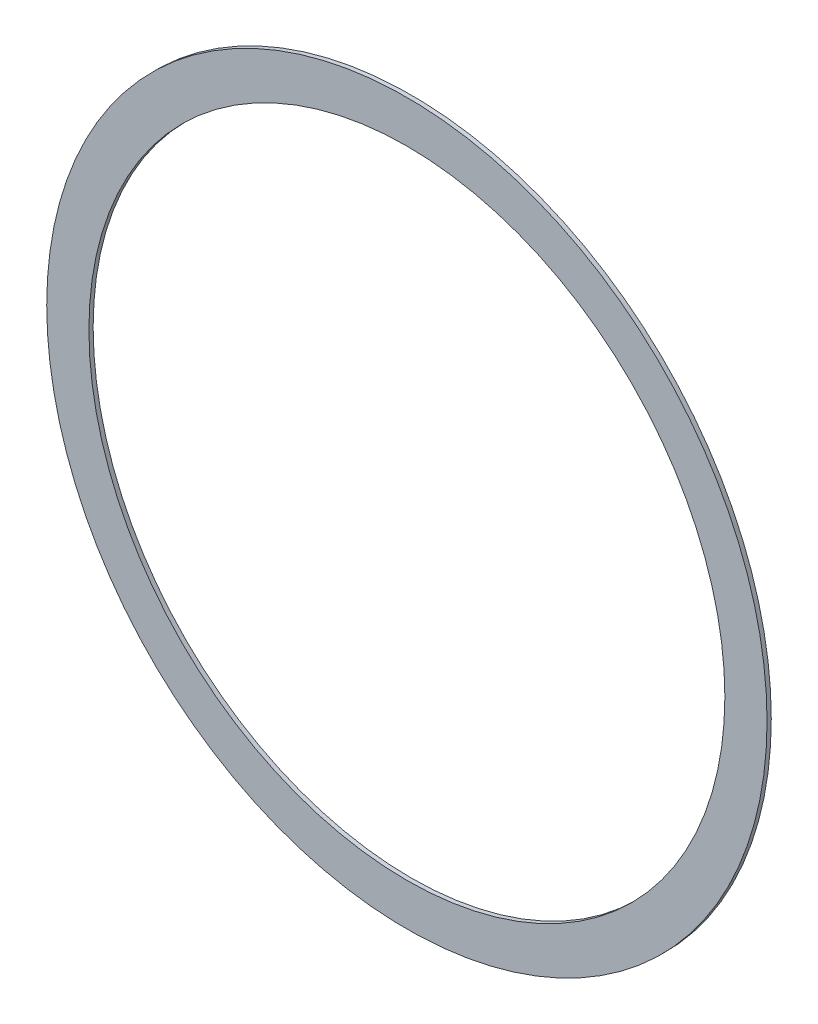
ISO-10303-21;
HEADER;
FILE_DESCRIPTION(('STEP AP214'),'2;1');
FILE_NAME('part.step','',(''),(''),'','','');
FILE_SCHEMA(('AUTOMOTIVE_DESIGN { 1 0 10303 214 1 1 1 1 }'));
ENDSEC;
DATA;
#1=APPLICATION_CONTEXT('core data for automotive mechanical design processes');
#2=APPLICATION_PROTOCOL_DEFINITION('international standard','automotive_design',2000,#1);
#3=PRODUCT_CONTEXT('',#1,'mechanical');
#4=PRODUCT('Part','Part','',(#3));
#5=PRODUCT_RELATED_PRODUCT_CATEGORY('part','',(#4));
#6=PRODUCT_DEFINITION_FORMATION('','',#4);
#7=PRODUCT_DEFINITION_CONTEXT('part definition',#1,'design');
#8=PRODUCT_DEFINITION('design','',#6,#7);
#9=PRODUCT_DEFINITION_SHAPE('','',#8);
#10=(LENGTH_UNIT() NAMED_UNIT(*) SI_UNIT(.MILLI.,.METRE.));
#11=(NAMED_UNIT(*) PLANE_ANGLE_UNIT() SI_UNIT($,.RADIAN.));
#12=(NAMED_UNIT(*) SI_UNIT($,.STERADIAN.) SOLID_ANGLE_UNIT());
#13=UNCERTAINTY_MEASURE_WITH_UNIT(LENGTH_MEASURE(1.E-05),#10,'distance_accuracy_value','');
#14=(GEOMETRIC_REPRESENTATION_CONTEXT(3) GLOBAL_UNCERTAINTY_ASSIGNED_CONTEXT((#13)) GLOBAL_UNIT_ASSIGNED_CONTEXT((#10,
#11,#12)) REPRESENTATION_CONTEXT('',''));
#15=CARTESIAN_POINT('',(0.,0.,0.));
#16=DIRECTION('',(0.,0.,1.));
#17=DIRECTION('',(1.,0.,0.));
#18=AXIS2_PLACEMENT_3D('',#15,#16,#17);
#19=CARTESIAN_POINT('',(0.,0.,0.389935));
#20=DIRECTION('',(0.,0.,1.));
#21=DIRECTION('',(1.,0.,0.));
#22=AXIS2_PLACEMENT_3D('',#19,#20,#21);
#23=PLANE('',#22);
#24=CARTESIAN_POINT('',(0.,0.,0.389935));
#25=DIRECTION('',(0.,0.,1.));
#26=DIRECTION('',(1.,0.,0.));
#27=AXIS2_PLACEMENT_3D('',#24,#25,#26);
#28=CIRCLE('',#27,49.2599565);
#29=CARTESIAN_POINT('',(49.2599565,0.,0.389935));
#30=VERTEX_POINT('',#29);
#31=EDGE_CURVE('E10',#30,#30,#28,.T.);
#32=ORIENTED_EDGE('',*,*,#31,.T.);
#33=EDGE_LOOP('',(#32));
#34=FACE_BOUND('',#33,.T.);
#35=CARTESIAN_POINT('',(0.,0.,0.389935));
#36=DIRECTION('',(0.,0.,1.));
#37=DIRECTION('',(1.,0.,0.));
#38=AXIS2_PLACEMENT_3D('',#35,#36,#37);
#39=CIRCLE('',#38,43.49025);
#40=CARTESIAN_POINT('',(43.49025,0.,0.389935));
#41=VERTEX_POINT('',#40);
#42=EDGE_CURVE('E43',#41,#41,#39,.T.);
#43=ORIENTED_EDGE('',*,*,#42,.F.);
#44=EDGE_LOOP('',(#43));
#45=FACE_BOUND('',#44,.T.);
#46=ADVANCED_FACE('F32',(#34,#45),#23,.T.);
#47=CARTESIAN_POINT('',(0.,0.,-0.189935));
#48=DIRECTION('',(0.,0.,1.));
#49=DIRECTION('',(1.,0.,0.));
#50=AXIS2_PLACEMENT_3D('',#47,#48,#49);
#51=PLANE('',#50);
#52=CARTESIAN_POINT('',(0.,0.,-0.189935));
#53=DIRECTION('',(0.,0.,1.));
#54=DIRECTION('',(1.,0.,0.));
#55=AXIS2_PLACEMENT_3D('',#52,#53,#54);
#56=CIRCLE('',#55,49.2599565);
#57=CARTESIAN_POINT('',(49.2599565,0.,-0.189935));
#58=VERTEX_POINT('',#57);
#59=EDGE_CURVE('E36',#58,#58,#56,.T.);
#60=ORIENTED_EDGE('',*,*,#59,.F.);
#61=EDGE_LOOP('',(#60));
#62=FACE_BOUND('',#61,.T.);
#63=CARTESIAN_POINT('',(0.,0.,-0.189935));
#64=DIRECTION('',(0.,0.,1.));
#65=DIRECTION('',(1.,0.,0.));
#66=AXIS2_PLACEMENT_3D('',#63,#64,#65);
#67=CIRCLE('',#66,43.49025);
#68=CARTESIAN_POINT('',(43.49025,0.,-0.189935));
#69=VERTEX_POINT('',#68);
#70=EDGE_CURVE('E45',#69,#69,#67,.T.);
#71=ORIENTED_EDGE('',*,*,#70,.T.);
#72=EDGE_LOOP('',(#71));
#73=FACE_BOUND('',#72,.T.);
#74=ADVANCED_FACE('F55',(#62,#73),#51,.F.);
#75=CARTESIAN_POINT('',(0.,0.,0.389935));
#76=DIRECTION('',(0.,0.,-1.));
#77=DIRECTION('',(-1.,0.,0.));
#78=AXIS2_PLACEMENT_3D('',#75,#76,#77);
#79=CYLINDRICAL_SURFACE('',#78,49.2599565);
#80=ORIENTED_EDGE('',*,*,#31,.F.);
#81=EDGE_LOOP('',(#80));
#82=FACE_BOUND('',#81,.T.);
#83=ORIENTED_EDGE('',*,*,#59,.T.);
#84=EDGE_LOOP('',(#83));
#85=FACE_BOUND('',#84,.T.);
#86=ADVANCED_FACE('F34',(#82,#85),#79,.T.);
#87=CARTESIAN_POINT('',(0.,0.,0.389935));
#88=DIRECTION('',(0.,0.,-1.));
#89=DIRECTION('',(-1.,0.,0.));
#90=AXIS2_PLACEMENT_3D('',#87,#88,#89);
#91=CYLINDRICAL_SURFACE('',#90,43.49025);
#92=ORIENTED_EDGE('',*,*,#42,.T.);
#93=EDGE_LOOP('',(#92));
#94=FACE_BOUND('',#93,.T.);
#95=ORIENTED_EDGE('',*,*,#70,.F.);
#96=EDGE_LOOP('',(#95));
#97=FACE_BOUND('',#96,.T.);
#98=ADVANCED_FACE('F51',(#94,#97),#91,.F.);
#99=CLOSED_SHELL('',(#46,#74,#86,#98));
#100=MANIFOLD_SOLID_BREP('B2',#99);
#101=ADVANCED_BREP_SHAPE_REPRESENTATION('',(#18,#100),#14);
#102=SHAPE_DEFINITION_REPRESENTATION(#9,#101);
ENDSEC;
END-ISO-10303-21;
